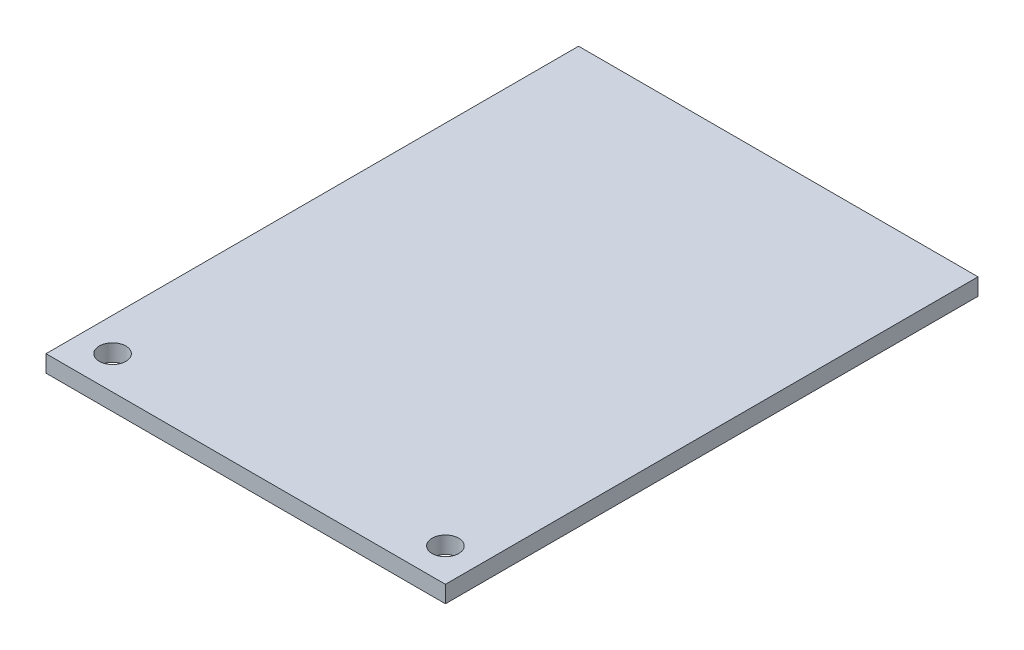
ISO-10303-21;
HEADER;
FILE_DESCRIPTION(('STEP AP214'),'2;1');
FILE_NAME('part.step','',(''),(''),'','','');
FILE_SCHEMA(('AUTOMOTIVE_DESIGN { 1 0 10303 214 1 1 1 1 }'));
ENDSEC;
DATA;
#1=APPLICATION_CONTEXT('core data for automotive mechanical design processes');
#2=APPLICATION_PROTOCOL_DEFINITION('international standard','automotive_design',2000,#1);
#3=PRODUCT_CONTEXT('',#1,'mechanical');
#4=PRODUCT('Part','Part','',(#3));
#5=PRODUCT_RELATED_PRODUCT_CATEGORY('part','',(#4));
#6=PRODUCT_DEFINITION_FORMATION('','',#4);
#7=PRODUCT_DEFINITION_CONTEXT('part definition',#1,'design');
#8=PRODUCT_DEFINITION('design','',#6,#7);
#9=PRODUCT_DEFINITION_SHAPE('','',#8);
#10=(LENGTH_UNIT() NAMED_UNIT(*) SI_UNIT(.MILLI.,.METRE.));
#11=(NAMED_UNIT(*) PLANE_ANGLE_UNIT() SI_UNIT($,.RADIAN.));
#12=(NAMED_UNIT(*) SI_UNIT($,.STERADIAN.) SOLID_ANGLE_UNIT());
#13=UNCERTAINTY_MEASURE_WITH_UNIT(LENGTH_MEASURE(1.E-05),#10,'distance_accuracy_value','');
#14=(GEOMETRIC_REPRESENTATION_CONTEXT(3) GLOBAL_UNCERTAINTY_ASSIGNED_CONTEXT((#13)) GLOBAL_UNIT_ASSIGNED_CONTEXT((#10,
#11,#12)) REPRESENTATION_CONTEXT('',''));
#15=CARTESIAN_POINT('',(0.,0.,0.));
#16=DIRECTION('',(0.,0.,1.));
#17=DIRECTION('',(1.,0.,0.));
#18=AXIS2_PLACEMENT_3D('',#15,#16,#17);
#19=CARTESIAN_POINT('',(30.,2.54,-40.));
#20=DIRECTION('',(-1.,0.,0.));
#21=DIRECTION('',(0.,0.,1.));
#22=AXIS2_PLACEMENT_3D('',#19,#20,#21);
#23=PLANE('',#22);
#24=DIRECTION('',(0.,0.,-1.));
#25=VECTOR('',#24,1.);
#26=CARTESIAN_POINT('',(30.,0.,-40.));
#27=LINE('',#26,#25);
#28=CARTESIAN_POINT('',(30.,0.,40.));
#29=VERTEX_POINT('',#28);
#30=CARTESIAN_POINT('',(30.,0.,-40.));
#31=VERTEX_POINT('',#30);
#32=EDGE_CURVE('E107',#29,#31,#27,.T.);
#33=ORIENTED_EDGE('',*,*,#32,.T.);
#34=DIRECTION('',(0.,-1.,0.));
#35=VECTOR('',#34,1.);
#36=CARTESIAN_POINT('',(30.,2.54,-40.));
#37=LINE('',#36,#35);
#38=CARTESIAN_POINT('',(30.,2.54,-40.));
#39=VERTEX_POINT('',#38);
#40=EDGE_CURVE('E11',#39,#31,#37,.T.);
#41=ORIENTED_EDGE('',*,*,#40,.F.);
#42=DIRECTION('',(0.,0.,-1.));
#43=VECTOR('',#42,1.);
#44=CARTESIAN_POINT('',(30.,2.54,-40.));
#45=LINE('',#44,#43);
#46=CARTESIAN_POINT('',(30.,2.54,40.));
#47=VERTEX_POINT('',#46);
#48=EDGE_CURVE('E91',#47,#39,#45,.T.);
#49=ORIENTED_EDGE('',*,*,#48,.F.);
#50=DIRECTION('',(0.,-1.,0.));
#51=VECTOR('',#50,1.);
#52=CARTESIAN_POINT('',(30.,2.54,40.));
#53=LINE('',#52,#51);
#54=EDGE_CURVE('E103',#47,#29,#53,.T.);
#55=ORIENTED_EDGE('',*,*,#54,.T.);
#56=EDGE_LOOP('',(#33,#41,#49,#55));
#57=FACE_BOUND('',#56,.T.);
#58=ADVANCED_FACE('F39',(#57),#23,.F.);
#59=CARTESIAN_POINT('',(-30.,2.54,-40.));
#60=DIRECTION('',(0.,0.,1.));
#61=DIRECTION('',(1.,0.,0.));
#62=AXIS2_PLACEMENT_3D('',#59,#60,#61);
#63=PLANE('',#62);
#64=DIRECTION('',(-1.,0.,0.));
#65=VECTOR('',#64,1.);
#66=CARTESIAN_POINT('',(-30.,0.,-40.));
#67=LINE('',#66,#65);
#68=CARTESIAN_POINT('',(-30.,0.,-40.));
#69=VERTEX_POINT('',#68);
#70=EDGE_CURVE('E96',#31,#69,#67,.T.);
#71=ORIENTED_EDGE('',*,*,#70,.T.);
#72=DIRECTION('',(0.,-1.,0.));
#73=VECTOR('',#72,1.);
#74=CARTESIAN_POINT('',(-30.,2.54,-40.));
#75=LINE('',#74,#73);
#76=CARTESIAN_POINT('',(-30.,2.54,-40.));
#77=VERTEX_POINT('',#76);
#78=EDGE_CURVE('E48',#77,#69,#75,.T.);
#79=ORIENTED_EDGE('',*,*,#78,.F.);
#80=DIRECTION('',(-1.,0.,0.));
#81=VECTOR('',#80,1.);
#82=CARTESIAN_POINT('',(-30.,2.54,-40.));
#83=LINE('',#82,#81);
#84=EDGE_CURVE('E86',#39,#77,#83,.T.);
#85=ORIENTED_EDGE('',*,*,#84,.F.);
#86=ORIENTED_EDGE('',*,*,#40,.T.);
#87=EDGE_LOOP('',(#71,#79,#85,#86));
#88=FACE_BOUND('',#87,.T.);
#89=ADVANCED_FACE('F95',(#88),#63,.F.);
#90=CARTESIAN_POINT('',(-30.,2.54,-40.));
#91=DIRECTION('',(1.,0.,0.));
#92=DIRECTION('',(0.,0.,-1.));
#93=AXIS2_PLACEMENT_3D('',#90,#91,#92);
#94=PLANE('',#93);
#95=DIRECTION('',(0.,0.,1.));
#96=VECTOR('',#95,1.);
#97=CARTESIAN_POINT('',(-30.,0.,-40.));
#98=LINE('',#97,#96);
#99=CARTESIAN_POINT('',(-30.,0.,40.));
#100=VERTEX_POINT('',#99);
#101=EDGE_CURVE('E73',#69,#100,#98,.T.);
#102=ORIENTED_EDGE('',*,*,#101,.T.);
#103=DIRECTION('',(0.,-1.,0.));
#104=VECTOR('',#103,1.);
#105=CARTESIAN_POINT('',(-30.,2.54,40.));
#106=LINE('',#105,#104);
#107=CARTESIAN_POINT('',(-30.,2.54,40.));
#108=VERTEX_POINT('',#107);
#109=EDGE_CURVE('E98',#108,#100,#106,.T.);
#110=ORIENTED_EDGE('',*,*,#109,.F.);
#111=DIRECTION('',(0.,0.,1.));
#112=VECTOR('',#111,1.);
#113=CARTESIAN_POINT('',(-30.,2.54,-40.));
#114=LINE('',#113,#112);
#115=EDGE_CURVE('E89',#77,#108,#114,.T.);
#116=ORIENTED_EDGE('',*,*,#115,.F.);
#117=ORIENTED_EDGE('',*,*,#78,.T.);
#118=EDGE_LOOP('',(#102,#110,#116,#117));
#119=FACE_BOUND('',#118,.T.);
#120=ADVANCED_FACE('F99',(#119),#94,.F.);
#121=CARTESIAN_POINT('',(-30.,2.54,40.));
#122=DIRECTION('',(0.,0.,-1.));
#123=DIRECTION('',(-1.,0.,0.));
#124=AXIS2_PLACEMENT_3D('',#121,#122,#123);
#125=PLANE('',#124);
#126=DIRECTION('',(1.,0.,0.));
#127=VECTOR('',#126,1.);
#128=CARTESIAN_POINT('',(-30.,0.,40.));
#129=LINE('',#128,#127);
#130=EDGE_CURVE('E79',#100,#29,#129,.T.);
#131=ORIENTED_EDGE('',*,*,#130,.T.);
#132=ORIENTED_EDGE('',*,*,#54,.F.);
#133=DIRECTION('',(1.,0.,0.));
#134=VECTOR('',#133,1.);
#135=CARTESIAN_POINT('',(-30.,2.54,40.));
#136=LINE('',#135,#134);
#137=EDGE_CURVE('E56',#108,#47,#136,.T.);
#138=ORIENTED_EDGE('',*,*,#137,.F.);
#139=ORIENTED_EDGE('',*,*,#109,.T.);
#140=EDGE_LOOP('',(#131,#132,#138,#139));
#141=FACE_BOUND('',#140,.T.);
#142=ADVANCED_FACE('F121',(#141),#125,.F.);
#143=CARTESIAN_POINT('',(0.,2.54,0.));
#144=DIRECTION('',(0.,1.,0.));
#145=DIRECTION('',(0.,0.,1.));
#146=AXIS2_PLACEMENT_3D('',#143,#144,#145);
#147=PLANE('',#146);
#148=CARTESIAN_POINT('',(25.,2.54,35.));
#149=DIRECTION('',(0.,-1.,0.));
#150=DIRECTION('',(0.,0.,1.));
#151=AXIS2_PLACEMENT_3D('',#148,#149,#150);
#152=CIRCLE('',#151,2.00000000000001);
#153=CARTESIAN_POINT('',(25.,2.54,37.));
#154=VERTEX_POINT('',#153);
#155=EDGE_CURVE('E136',#154,#154,#152,.T.);
#156=ORIENTED_EDGE('',*,*,#155,.T.);
#157=EDGE_LOOP('',(#156));
#158=FACE_BOUND('',#157,.T.);
#159=CARTESIAN_POINT('',(-25.,2.54,35.));
#160=DIRECTION('',(0.,1.,0.));
#161=DIRECTION('',(0.,0.,1.));
#162=AXIS2_PLACEMENT_3D('',#159,#160,#161);
#163=CIRCLE('',#162,2.00000000000001);
#164=CARTESIAN_POINT('',(-25.,2.54,37.));
#165=VERTEX_POINT('',#164);
#166=EDGE_CURVE('E128',#165,#165,#163,.T.);
#167=ORIENTED_EDGE('',*,*,#166,.F.);
#168=EDGE_LOOP('',(#167));
#169=FACE_BOUND('',#168,.T.);
#170=ORIENTED_EDGE('',*,*,#48,.T.);
#171=ORIENTED_EDGE('',*,*,#84,.T.);
#172=ORIENTED_EDGE('',*,*,#115,.T.);
#173=ORIENTED_EDGE('',*,*,#137,.T.);
#174=EDGE_LOOP('',(#170,#171,#172,#173));
#175=FACE_BOUND('',#174,.T.);
#176=ADVANCED_FACE('F87',(#158,#169,#175),#147,.T.);
#177=CARTESIAN_POINT('',(0.,0.,0.));
#178=DIRECTION('',(0.,1.,0.));
#179=DIRECTION('',(0.,0.,1.));
#180=AXIS2_PLACEMENT_3D('',#177,#178,#179);
#181=PLANE('',#180);
#182=CARTESIAN_POINT('',(25.,0.,35.));
#183=DIRECTION('',(0.,-1.,0.));
#184=DIRECTION('',(0.,0.,1.));
#185=AXIS2_PLACEMENT_3D('',#182,#183,#184);
#186=CIRCLE('',#185,2.00000000000001);
#187=CARTESIAN_POINT('',(25.,0.,37.));
#188=VERTEX_POINT('',#187);
#189=EDGE_CURVE('E132',#188,#188,#186,.T.);
#190=ORIENTED_EDGE('',*,*,#189,.F.);
#191=EDGE_LOOP('',(#190));
#192=FACE_BOUND('',#191,.T.);
#193=CARTESIAN_POINT('',(-25.,0.,35.));
#194=DIRECTION('',(0.,1.,0.));
#195=DIRECTION('',(0.,0.,1.));
#196=AXIS2_PLACEMENT_3D('',#193,#194,#195);
#197=CIRCLE('',#196,2.00000000000001);
#198=CARTESIAN_POINT('',(-25.,0.,37.));
#199=VERTEX_POINT('',#198);
#200=EDGE_CURVE('E111',#199,#199,#197,.T.);
#201=ORIENTED_EDGE('',*,*,#200,.T.);
#202=EDGE_LOOP('',(#201));
#203=FACE_BOUND('',#202,.T.);
#204=ORIENTED_EDGE('',*,*,#32,.F.);
#205=ORIENTED_EDGE('',*,*,#130,.F.);
#206=ORIENTED_EDGE('',*,*,#101,.F.);
#207=ORIENTED_EDGE('',*,*,#70,.F.);
#208=EDGE_LOOP('',(#204,#205,#206,#207));
#209=FACE_BOUND('',#208,.T.);
#210=ADVANCED_FACE('F124',(#192,#203,#209),#181,.F.);
#211=CARTESIAN_POINT('',(-25.,0.,35.));
#212=DIRECTION('',(0.,1.,0.));
#213=DIRECTION('',(0.,0.,1.));
#214=AXIS2_PLACEMENT_3D('',#211,#212,#213);
#215=CYLINDRICAL_SURFACE('',#214,2.00000000000001);
#216=ORIENTED_EDGE('',*,*,#200,.F.);
#217=EDGE_LOOP('',(#216));
#218=FACE_BOUND('',#217,.T.);
#219=ORIENTED_EDGE('',*,*,#166,.T.);
#220=EDGE_LOOP('',(#219));
#221=FACE_BOUND('',#220,.T.);
#222=ADVANCED_FACE('F149',(#218,#221),#215,.F.);
#223=CARTESIAN_POINT('',(25.,0.,35.));
#224=DIRECTION('',(0.,1.,0.));
#225=DIRECTION('',(0.,0.,1.));
#226=AXIS2_PLACEMENT_3D('',#223,#224,#225);
#227=CYLINDRICAL_SURFACE('',#226,2.00000000000001);
#228=ORIENTED_EDGE('',*,*,#189,.T.);
#229=EDGE_LOOP('',(#228));
#230=FACE_BOUND('',#229,.T.);
#231=ORIENTED_EDGE('',*,*,#155,.F.);
#232=EDGE_LOOP('',(#231));
#233=FACE_BOUND('',#232,.T.);
#234=ADVANCED_FACE('F144',(#230,#233),#227,.F.);
#235=CLOSED_SHELL('',(#58,#89,#120,#142,#176,#210,#222,#234));
#236=MANIFOLD_SOLID_BREP('B2',#235);
#237=ADVANCED_BREP_SHAPE_REPRESENTATION('',(#18,#236),#14);
#238=SHAPE_DEFINITION_REPRESENTATION(#9,#237);
ENDSEC;
END-ISO-10303-21;
